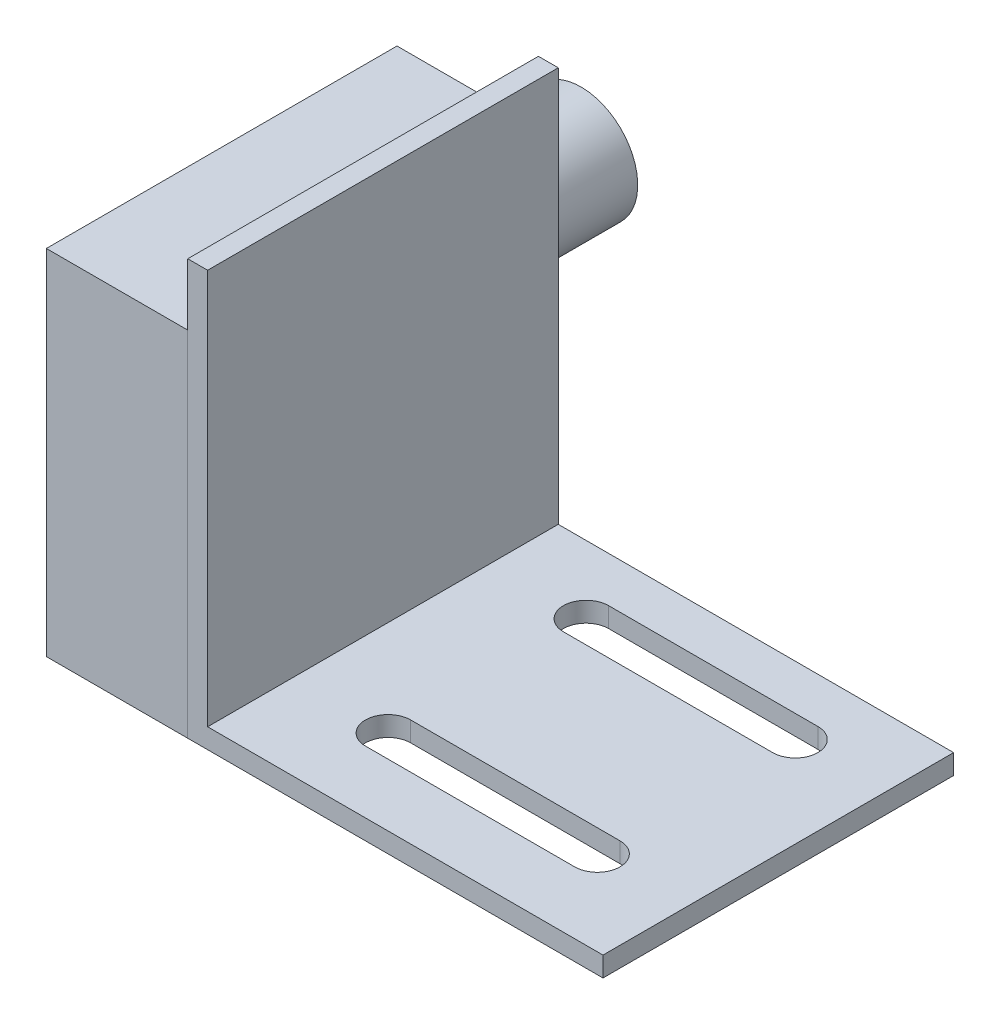
ISO-10303-21;
HEADER;
FILE_DESCRIPTION(('STEP AP214'),'2;1');
FILE_NAME('part.step','',(''),(''),'','','');
FILE_SCHEMA(('AUTOMOTIVE_DESIGN { 1 0 10303 214 1 1 1 1 }'));
ENDSEC;
DATA;
#1=APPLICATION_CONTEXT('core data for automotive mechanical design processes');
#2=APPLICATION_PROTOCOL_DEFINITION('international standard','automotive_design',2000,#1);
#3=PRODUCT_CONTEXT('',#1,'mechanical');
#4=PRODUCT('Part','Part','',(#3));
#5=PRODUCT_RELATED_PRODUCT_CATEGORY('part','',(#4));
#6=PRODUCT_DEFINITION_FORMATION('','',#4);
#7=PRODUCT_DEFINITION_CONTEXT('part definition',#1,'design');
#8=PRODUCT_DEFINITION('design','',#6,#7);
#9=PRODUCT_DEFINITION_SHAPE('','',#8);
#10=(LENGTH_UNIT() NAMED_UNIT(*) SI_UNIT(.MILLI.,.METRE.));
#11=(NAMED_UNIT(*) PLANE_ANGLE_UNIT() SI_UNIT($,.RADIAN.));
#12=(NAMED_UNIT(*) SI_UNIT($,.STERADIAN.) SOLID_ANGLE_UNIT());
#13=UNCERTAINTY_MEASURE_WITH_UNIT(LENGTH_MEASURE(1.E-05),#10,'distance_accuracy_value','');
#14=(GEOMETRIC_REPRESENTATION_CONTEXT(3) GLOBAL_UNCERTAINTY_ASSIGNED_CONTEXT((#13)) GLOBAL_UNIT_ASSIGNED_CONTEXT((#10,
#11,#12)) REPRESENTATION_CONTEXT('',''));
#15=CARTESIAN_POINT('',(0.,0.,0.));
#16=DIRECTION('',(0.,0.,1.));
#17=DIRECTION('',(1.,0.,0.));
#18=AXIS2_PLACEMENT_3D('',#15,#16,#17);
#19=CARTESIAN_POINT('',(-12.7,0.,15.748));
#20=DIRECTION('',(0.,0.,-1.));
#21=DIRECTION('',(-1.,0.,0.));
#22=AXIS2_PLACEMENT_3D('',#19,#20,#21);
#23=PLANE('',#22);
#24=DIRECTION('',(0.,1.,0.));
#25=VECTOR('',#24,1.);
#26=CARTESIAN_POINT('',(0.,0.,15.748));
#27=LINE('',#26,#25);
#28=CARTESIAN_POINT('',(0.,0.,15.748));
#29=VERTEX_POINT('',#28);
#30=CARTESIAN_POINT('',(0.,31.75,15.748));
#31=VERTEX_POINT('',#30);
#32=EDGE_CURVE('E110',#29,#31,#27,.T.);
#33=ORIENTED_EDGE('',*,*,#32,.T.);
#34=DIRECTION('',(1.,0.,0.));
#35=VECTOR('',#34,1.);
#36=CARTESIAN_POINT('',(-12.7,31.75,15.748));
#37=LINE('',#36,#35);
#38=CARTESIAN_POINT('',(-12.7,31.75,15.748));
#39=VERTEX_POINT('',#38);
#40=EDGE_CURVE('E47',#39,#31,#37,.T.);
#41=ORIENTED_EDGE('',*,*,#40,.F.);
#42=DIRECTION('',(0.,1.,0.));
#43=VECTOR('',#42,1.);
#44=CARTESIAN_POINT('',(-12.7,0.,15.748));
#45=LINE('',#44,#43);
#46=CARTESIAN_POINT('',(-12.7,0.,15.748));
#47=VERTEX_POINT('',#46);
#48=EDGE_CURVE('E97',#47,#39,#45,.T.);
#49=ORIENTED_EDGE('',*,*,#48,.F.);
#50=DIRECTION('',(1.,0.,0.));
#51=VECTOR('',#50,1.);
#52=CARTESIAN_POINT('',(-12.7,0.,15.748));
#53=LINE('',#52,#51);
#54=EDGE_CURVE('E106',#47,#29,#53,.T.);
#55=ORIENTED_EDGE('',*,*,#54,.T.);
#56=EDGE_LOOP('',(#33,#41,#49,#55));
#57=FACE_BOUND('',#56,.T.);
#58=ADVANCED_FACE('F44',(#57),#23,.F.);
#59=CARTESIAN_POINT('',(-12.7,31.75,15.748));
#60=DIRECTION('',(0.,-1.,0.));
#61=DIRECTION('',(0.,0.,-1.));
#62=AXIS2_PLACEMENT_3D('',#59,#60,#61);
#63=PLANE('',#62);
#64=DIRECTION('',(0.,0.,-1.));
#65=VECTOR('',#64,1.);
#66=CARTESIAN_POINT('',(0.,31.75,15.748));
#67=LINE('',#66,#65);
#68=CARTESIAN_POINT('',(0.,31.75,-15.748));
#69=VERTEX_POINT('',#68);
#70=EDGE_CURVE('E102',#31,#69,#67,.T.);
#71=ORIENTED_EDGE('',*,*,#70,.T.);
#72=DIRECTION('',(1.,0.,0.));
#73=VECTOR('',#72,1.);
#74=CARTESIAN_POINT('',(-12.7,31.75,-15.748));
#75=LINE('',#74,#73);
#76=CARTESIAN_POINT('',(-12.7,31.75,-15.748));
#77=VERTEX_POINT('',#76);
#78=EDGE_CURVE('E100',#77,#69,#75,.T.);
#79=ORIENTED_EDGE('',*,*,#78,.F.);
#80=DIRECTION('',(0.,0.,-1.));
#81=VECTOR('',#80,1.);
#82=CARTESIAN_POINT('',(-12.7,31.75,15.748));
#83=LINE('',#82,#81);
#84=EDGE_CURVE('E92',#39,#77,#83,.T.);
#85=ORIENTED_EDGE('',*,*,#84,.F.);
#86=ORIENTED_EDGE('',*,*,#40,.T.);
#87=EDGE_LOOP('',(#71,#79,#85,#86));
#88=FACE_BOUND('',#87,.T.);
#89=ADVANCED_FACE('F101',(#88),#63,.F.);
#90=CARTESIAN_POINT('',(-12.7,0.,-15.748));
#91=DIRECTION('',(0.,0.,1.));
#92=DIRECTION('',(1.,0.,0.));
#93=AXIS2_PLACEMENT_3D('',#90,#91,#92);
#94=PLANE('',#93);
#95=CARTESIAN_POINT('',(-6.32090999527844,21.59,-15.748));
#96=DIRECTION('',(0.,0.,-1.));
#97=DIRECTION('',(-1.,0.,0.));
#98=AXIS2_PLACEMENT_3D('',#95,#96,#97);
#99=CIRCLE('',#98,5.08);
#100=CARTESIAN_POINT('',(-11.4009099952784,21.59,-15.748));
#101=VERTEX_POINT('',#100);
#102=EDGE_CURVE('E12',#101,#101,#99,.T.);
#103=ORIENTED_EDGE('',*,*,#102,.F.);
#104=EDGE_LOOP('',(#103));
#105=FACE_BOUND('',#104,.T.);
#106=DIRECTION('',(0.,-1.,0.));
#107=VECTOR('',#106,1.);
#108=CARTESIAN_POINT('',(0.,0.,-15.748));
#109=LINE('',#108,#107);
#110=CARTESIAN_POINT('',(0.,0.,-15.748));
#111=VERTEX_POINT('',#110);
#112=EDGE_CURVE('E78',#69,#111,#109,.T.);
#113=ORIENTED_EDGE('',*,*,#112,.T.);
#114=DIRECTION('',(1.,0.,0.));
#115=VECTOR('',#114,1.);
#116=CARTESIAN_POINT('',(-12.7,0.,-15.748));
#117=LINE('',#116,#115);
#118=CARTESIAN_POINT('',(-12.7,0.,-15.748));
#119=VERTEX_POINT('',#118);
#120=EDGE_CURVE('E103',#119,#111,#117,.T.);
#121=ORIENTED_EDGE('',*,*,#120,.F.);
#122=DIRECTION('',(0.,-1.,0.));
#123=VECTOR('',#122,1.);
#124=CARTESIAN_POINT('',(-12.7,0.,-15.748));
#125=LINE('',#124,#123);
#126=EDGE_CURVE('E95',#77,#119,#125,.T.);
#127=ORIENTED_EDGE('',*,*,#126,.F.);
#128=ORIENTED_EDGE('',*,*,#78,.T.);
#129=EDGE_LOOP('',(#113,#121,#127,#128));
#130=FACE_BOUND('',#129,.T.);
#131=ADVANCED_FACE('F104',(#105,#130),#94,.F.);
#132=CARTESIAN_POINT('',(-12.7,0.,15.748));
#133=DIRECTION('',(0.,1.,0.));
#134=DIRECTION('',(0.,0.,1.));
#135=AXIS2_PLACEMENT_3D('',#132,#133,#134);
#136=PLANE('',#135);
#137=DIRECTION('',(0.,0.,1.));
#138=VECTOR('',#137,1.);
#139=CARTESIAN_POINT('',(0.,0.,15.748));
#140=LINE('',#139,#138);
#141=EDGE_CURVE('E84',#111,#29,#140,.T.);
#142=ORIENTED_EDGE('',*,*,#141,.T.);
#143=ORIENTED_EDGE('',*,*,#54,.F.);
#144=DIRECTION('',(0.,0.,1.));
#145=VECTOR('',#144,1.);
#146=CARTESIAN_POINT('',(-12.7,0.,15.748));
#147=LINE('',#146,#145);
#148=EDGE_CURVE('E61',#119,#47,#147,.T.);
#149=ORIENTED_EDGE('',*,*,#148,.F.);
#150=ORIENTED_EDGE('',*,*,#120,.T.);
#151=EDGE_LOOP('',(#142,#143,#149,#150));
#152=FACE_BOUND('',#151,.T.);
#153=ADVANCED_FACE('F118',(#152),#136,.F.);
#154=CARTESIAN_POINT('',(-12.7,0.,0.));
#155=DIRECTION('',(-1.,0.,0.));
#156=DIRECTION('',(0.,0.,1.));
#157=AXIS2_PLACEMENT_3D('',#154,#155,#156);
#158=PLANE('',#157);
#159=ORIENTED_EDGE('',*,*,#48,.T.);
#160=ORIENTED_EDGE('',*,*,#84,.T.);
#161=ORIENTED_EDGE('',*,*,#126,.T.);
#162=ORIENTED_EDGE('',*,*,#148,.T.);
#163=EDGE_LOOP('',(#159,#160,#161,#162));
#164=FACE_BOUND('',#163,.T.);
#165=ADVANCED_FACE('F93',(#164),#158,.T.);
#166=CARTESIAN_POINT('',(0.,0.,0.));
#167=DIRECTION('',(-1.,0.,0.));
#168=DIRECTION('',(0.,0.,1.));
#169=AXIS2_PLACEMENT_3D('',#166,#167,#168);
#170=PLANE('',#169);
#171=ORIENTED_EDGE('',*,*,#32,.F.);
#172=ORIENTED_EDGE('',*,*,#141,.F.);
#173=ORIENTED_EDGE('',*,*,#112,.F.);
#174=ORIENTED_EDGE('',*,*,#70,.F.);
#175=EDGE_LOOP('',(#171,#172,#173,#174));
#176=FACE_BOUND('',#175,.T.);
#177=ADVANCED_FACE('F121',(#176),#170,.F.);
#178=CARTESIAN_POINT('',(-6.32090999527844,21.59,-25.908));
#179=DIRECTION('',(0.,0.,1.));
#180=DIRECTION('',(1.,0.,0.));
#181=AXIS2_PLACEMENT_3D('',#178,#179,#180);
#182=CYLINDRICAL_SURFACE('',#181,5.08);
#183=CARTESIAN_POINT('',(-6.32090999527844,21.59,-25.908));
#184=DIRECTION('',(0.,0.,-1.));
#185=DIRECTION('',(-1.,0.,0.));
#186=AXIS2_PLACEMENT_3D('',#183,#184,#185);
#187=CIRCLE('',#186,5.08);
#188=CARTESIAN_POINT('',(-11.4009099952784,21.59,-25.908));
#189=VERTEX_POINT('',#188);
#190=EDGE_CURVE('E113',#189,#189,#187,.T.);
#191=ORIENTED_EDGE('',*,*,#190,.F.);
#192=EDGE_LOOP('',(#191));
#193=FACE_BOUND('',#192,.T.);
#194=ORIENTED_EDGE('',*,*,#102,.T.);
#195=EDGE_LOOP('',(#194));
#196=FACE_BOUND('',#195,.T.);
#197=ADVANCED_FACE('F129',(#193,#196),#182,.T.);
#198=CARTESIAN_POINT('',(-6.32090999527844,21.59,-25.908));
#199=DIRECTION('',(0.,0.,-1.));
#200=DIRECTION('',(-1.,0.,0.));
#201=AXIS2_PLACEMENT_3D('',#198,#199,#200);
#202=PLANE('',#201);
#203=ORIENTED_EDGE('',*,*,#190,.T.);
#204=EDGE_LOOP('',(#203));
#205=FACE_BOUND('',#204,.T.);
#206=ADVANCED_FACE('F127',(#205),#202,.T.);
#207=CLOSED_SHELL('',(#58,#89,#131,#153,#165,#177,#197,#206));
#208=MANIFOLD_SOLID_BREP('B2',#207);
#209=CARTESIAN_POINT('',(37.2983127050204,0.,15.748));
#210=DIRECTION('',(0.,1.,0.));
#211=DIRECTION('',(-1.,0.,0.));
#212=AXIS2_PLACEMENT_3D('',#209,#210,#211);
#213=PLANE('',#212);
#214=DIRECTION('',(1.,0.,0.));
#215=VECTOR('',#214,1.);
#216=CARTESIAN_POINT('',(29.1703127050204,0.,10.16));
#217=LINE('',#216,#215);
#218=CARTESIAN_POINT('',(10.3743127050204,0.,10.16));
#219=VERTEX_POINT('',#218);
#220=CARTESIAN_POINT('',(29.1703127050204,0.,10.16));
#221=VERTEX_POINT('',#220);
#222=EDGE_CURVE('E305',#219,#221,#217,.T.);
#223=ORIENTED_EDGE('',*,*,#222,.T.);
#224=CARTESIAN_POINT('',(29.1703127050204,0.,8.128));
#225=DIRECTION('',(0.,1.,0.));
#226=DIRECTION('',(0.,0.,1.));
#227=AXIS2_PLACEMENT_3D('',#224,#225,#226);
#228=CIRCLE('',#227,2.032);
#229=CARTESIAN_POINT('',(29.1703127050204,0.,6.096));
#230=VERTEX_POINT('',#229);
#231=EDGE_CURVE('E299',#221,#230,#228,.T.);
#232=ORIENTED_EDGE('',*,*,#231,.T.);
#233=DIRECTION('',(-1.,0.,0.));
#234=VECTOR('',#233,1.);
#235=CARTESIAN_POINT('',(29.1703127050204,0.,6.096));
#236=LINE('',#235,#234);
#237=CARTESIAN_POINT('',(10.3743127050204,0.,6.096));
#238=VERTEX_POINT('',#237);
#239=EDGE_CURVE('E308',#230,#238,#236,.T.);
#240=ORIENTED_EDGE('',*,*,#239,.T.);
#241=CARTESIAN_POINT('',(10.3743127050204,0.,8.128));
#242=DIRECTION('',(0.,1.,0.));
#243=DIRECTION('',(0.,0.,1.));
#244=AXIS2_PLACEMENT_3D('',#241,#242,#243);
#245=CIRCLE('',#244,2.032);
#246=EDGE_CURVE('E211',#238,#219,#245,.T.);
#247=ORIENTED_EDGE('',*,*,#246,.T.);
#248=EDGE_LOOP('',(#223,#232,#240,#247));
#249=FACE_BOUND('',#248,.T.);
#250=DIRECTION('',(1.,0.,0.));
#251=VECTOR('',#250,1.);
#252=CARTESIAN_POINT('',(29.1703127050204,0.,-7.62));
#253=LINE('',#252,#251);
#254=CARTESIAN_POINT('',(10.3743127050204,0.,-7.61999999999999));
#255=VERTEX_POINT('',#254);
#256=CARTESIAN_POINT('',(29.1703127050204,0.,-7.62));
#257=VERTEX_POINT('',#256);
#258=EDGE_CURVE('E343',#255,#257,#253,.T.);
#259=ORIENTED_EDGE('',*,*,#258,.T.);
#260=CARTESIAN_POINT('',(29.1703127050204,0.,-9.652));
#261=DIRECTION('',(0.,1.,0.));
#262=DIRECTION('',(0.,0.,1.));
#263=AXIS2_PLACEMENT_3D('',#260,#261,#262);
#264=CIRCLE('',#263,2.032);
#265=CARTESIAN_POINT('',(29.1703127050204,0.,-11.684));
#266=VERTEX_POINT('',#265);
#267=EDGE_CURVE('E333',#257,#266,#264,.T.);
#268=ORIENTED_EDGE('',*,*,#267,.T.);
#269=DIRECTION('',(-1.,0.,0.));
#270=VECTOR('',#269,1.);
#271=CARTESIAN_POINT('',(29.1703127050204,0.,-11.684));
#272=LINE('',#271,#270);
#273=CARTESIAN_POINT('',(10.3743127050204,0.,-11.684));
#274=VERTEX_POINT('',#273);
#275=EDGE_CURVE('E336',#266,#274,#272,.T.);
#276=ORIENTED_EDGE('',*,*,#275,.T.);
#277=CARTESIAN_POINT('',(10.3743127050204,0.,-9.652));
#278=DIRECTION('',(0.,1.,0.));
#279=DIRECTION('',(0.,0.,1.));
#280=AXIS2_PLACEMENT_3D('',#277,#278,#279);
#281=CIRCLE('',#280,2.032);
#282=EDGE_CURVE('E340',#274,#255,#281,.T.);
#283=ORIENTED_EDGE('',*,*,#282,.T.);
#284=EDGE_LOOP('',(#259,#268,#276,#283));
#285=FACE_BOUND('',#284,.T.);
#286=DIRECTION('',(1.,0.,0.));
#287=VECTOR('',#286,1.);
#288=CARTESIAN_POINT('',(37.2983127050204,0.,-15.748));
#289=LINE('',#288,#287);
#290=CARTESIAN_POINT('',(0.,0.,-15.748));
#291=VERTEX_POINT('',#290);
#292=CARTESIAN_POINT('',(37.2983127050204,0.,-15.748));
#293=VERTEX_POINT('',#292);
#294=EDGE_CURVE('E358',#291,#293,#289,.T.);
#295=ORIENTED_EDGE('',*,*,#294,.T.);
#296=DIRECTION('',(0.,0.,-1.));
#297=VECTOR('',#296,1.);
#298=CARTESIAN_POINT('',(37.2983127050204,0.,15.748));
#299=LINE('',#298,#297);
#300=CARTESIAN_POINT('',(37.2983127050204,0.,15.748));
#301=VERTEX_POINT('',#300);
#302=EDGE_CURVE('E42',#301,#293,#299,.T.);
#303=ORIENTED_EDGE('',*,*,#302,.F.);
#304=DIRECTION('',(1.,0.,0.));
#305=VECTOR('',#304,1.);
#306=CARTESIAN_POINT('',(37.2983127050204,0.,15.748));
#307=LINE('',#306,#305);
#308=CARTESIAN_POINT('',(0.,0.,15.748));
#309=VERTEX_POINT('',#308);
#310=EDGE_CURVE('E365',#309,#301,#307,.T.);
#311=ORIENTED_EDGE('',*,*,#310,.F.);
#312=DIRECTION('',(0.,0.,-1.));
#313=VECTOR('',#312,1.);
#314=CARTESIAN_POINT('',(0.,0.,15.748));
#315=LINE('',#314,#313);
#316=EDGE_CURVE('E379',#309,#291,#315,.T.);
#317=ORIENTED_EDGE('',*,*,#316,.T.);
#318=EDGE_LOOP('',(#295,#303,#311,#317));
#319=FACE_BOUND('',#318,.T.);
#320=ADVANCED_FACE('F197',(#249,#285,#319),#213,.F.);
#321=CARTESIAN_POINT('',(37.2983127050204,1.78490776787044,15.748));
#322=DIRECTION('',(-1.,0.,0.));
#323=DIRECTION('',(0.,0.,1.));
#324=AXIS2_PLACEMENT_3D('',#321,#322,#323);
#325=PLANE('',#324);
#326=DIRECTION('',(0.,1.,0.));
#327=VECTOR('',#326,1.);
#328=CARTESIAN_POINT('',(37.2983127050204,1.78490776787044,-15.748));
#329=LINE('',#328,#327);
#330=CARTESIAN_POINT('',(37.2983127050204,1.78490776787044,-15.748));
#331=VERTEX_POINT('',#330);
#332=EDGE_CURVE('E382',#293,#331,#329,.T.);
#333=ORIENTED_EDGE('',*,*,#332,.T.);
#334=DIRECTION('',(0.,0.,-1.));
#335=VECTOR('',#334,1.);
#336=CARTESIAN_POINT('',(37.2983127050204,1.78490776787044,15.748));
#337=LINE('',#336,#335);
#338=CARTESIAN_POINT('',(37.2983127050204,1.78490776787044,15.748));
#339=VERTEX_POINT('',#338);
#340=EDGE_CURVE('E204',#339,#331,#337,.T.);
#341=ORIENTED_EDGE('',*,*,#340,.F.);
#342=DIRECTION('',(0.,1.,0.));
#343=VECTOR('',#342,1.);
#344=CARTESIAN_POINT('',(37.2983127050204,1.78490776787044,15.748));
#345=LINE('',#344,#343);
#346=EDGE_CURVE('E368',#301,#339,#345,.T.);
#347=ORIENTED_EDGE('',*,*,#346,.F.);
#348=ORIENTED_EDGE('',*,*,#302,.T.);
#349=EDGE_LOOP('',(#333,#341,#347,#348));
#350=FACE_BOUND('',#349,.T.);
#351=ADVANCED_FACE('F429',(#350),#325,.F.);
#352=CARTESIAN_POINT('',(1.78490776787044,1.78490776787044,15.748));
#353=DIRECTION('',(0.,-1.,0.));
#354=DIRECTION('',(0.,0.,-1.));
#355=AXIS2_PLACEMENT_3D('',#352,#353,#354);
#356=PLANE('',#355);
#357=DIRECTION('',(-1.,0.,0.));
#358=VECTOR('',#357,1.);
#359=CARTESIAN_POINT('',(29.1703127050204,1.78490776787044,6.096));
#360=LINE('',#359,#358);
#361=CARTESIAN_POINT('',(29.1703127050204,1.78490776787044,6.096));
#362=VERTEX_POINT('',#361);
#363=CARTESIAN_POINT('',(10.3743127050204,1.78490776787044,6.096));
#364=VERTEX_POINT('',#363);
#365=EDGE_CURVE('E323',#362,#364,#360,.T.);
#366=ORIENTED_EDGE('',*,*,#365,.F.);
#367=CARTESIAN_POINT('',(29.1703127050204,1.78490776787044,8.128));
#368=DIRECTION('',(0.,1.,0.));
#369=DIRECTION('',(0.,0.,1.));
#370=AXIS2_PLACEMENT_3D('',#367,#368,#369);
#371=CIRCLE('',#370,2.032);
#372=CARTESIAN_POINT('',(29.1703127050204,1.78490776787044,10.16));
#373=VERTEX_POINT('',#372);
#374=EDGE_CURVE('E219',#373,#362,#371,.T.);
#375=ORIENTED_EDGE('',*,*,#374,.F.);
#376=DIRECTION('',(1.,0.,0.));
#377=VECTOR('',#376,1.);
#378=CARTESIAN_POINT('',(29.1703127050204,1.78490776787044,10.16));
#379=LINE('',#378,#377);
#380=CARTESIAN_POINT('',(10.3743127050204,1.78490776787044,10.16));
#381=VERTEX_POINT('',#380);
#382=EDGE_CURVE('E314',#381,#373,#379,.T.);
#383=ORIENTED_EDGE('',*,*,#382,.F.);
#384=CARTESIAN_POINT('',(10.3743127050204,1.78490776787044,8.128));
#385=DIRECTION('',(0.,1.,0.));
#386=DIRECTION('',(0.,0.,1.));
#387=AXIS2_PLACEMENT_3D('',#384,#385,#386);
#388=CIRCLE('',#387,2.032);
#389=EDGE_CURVE('E317',#364,#381,#388,.T.);
#390=ORIENTED_EDGE('',*,*,#389,.F.);
#391=EDGE_LOOP('',(#366,#375,#383,#390));
#392=FACE_BOUND('',#391,.T.);
#393=DIRECTION('',(-1.,0.,0.));
#394=VECTOR('',#393,1.);
#395=CARTESIAN_POINT('',(29.1703127050204,1.78490776787044,-11.684));
#396=LINE('',#395,#394);
#397=CARTESIAN_POINT('',(29.1703127050204,1.78490776787044,-11.684));
#398=VERTEX_POINT('',#397);
#399=CARTESIAN_POINT('',(10.3743127050204,1.78490776787044,-11.684));
#400=VERTEX_POINT('',#399);
#401=EDGE_CURVE('E348',#398,#400,#396,.T.);
#402=ORIENTED_EDGE('',*,*,#401,.F.);
#403=CARTESIAN_POINT('',(29.1703127050204,1.78490776787044,-9.652));
#404=DIRECTION('',(0.,1.,0.));
#405=DIRECTION('',(0.,0.,1.));
#406=AXIS2_PLACEMENT_3D('',#403,#404,#405);
#407=CIRCLE('',#406,2.032);
#408=CARTESIAN_POINT('',(29.1703127050204,1.78490776787044,-7.62));
#409=VERTEX_POINT('',#408);
#410=EDGE_CURVE('E329',#409,#398,#407,.T.);
#411=ORIENTED_EDGE('',*,*,#410,.F.);
#412=DIRECTION('',(1.,0.,0.));
#413=VECTOR('',#412,1.);
#414=CARTESIAN_POINT('',(29.1703127050204,1.78490776787044,-7.62));
#415=LINE('',#414,#413);
#416=CARTESIAN_POINT('',(10.3743127050204,1.78490776787044,-7.61999999999999));
#417=VERTEX_POINT('',#416);
#418=EDGE_CURVE('E337',#417,#409,#415,.T.);
#419=ORIENTED_EDGE('',*,*,#418,.F.);
#420=CARTESIAN_POINT('',(10.3743127050204,1.78490776787044,-9.652));
#421=DIRECTION('',(0.,1.,0.));
#422=DIRECTION('',(0.,0.,1.));
#423=AXIS2_PLACEMENT_3D('',#420,#421,#422);
#424=CIRCLE('',#423,2.032);
#425=EDGE_CURVE('E351',#400,#417,#424,.T.);
#426=ORIENTED_EDGE('',*,*,#425,.F.);
#427=EDGE_LOOP('',(#402,#411,#419,#426));
#428=FACE_BOUND('',#427,.T.);
#429=DIRECTION('',(-1.,0.,0.));
#430=VECTOR('',#429,1.);
#431=CARTESIAN_POINT('',(1.78490776787044,1.78490776787044,-15.748));
#432=LINE('',#431,#430);
#433=CARTESIAN_POINT('',(1.78490776787044,1.78490776787044,-15.748));
#434=VERTEX_POINT('',#433);
#435=EDGE_CURVE('E384',#331,#434,#432,.T.);
#436=ORIENTED_EDGE('',*,*,#435,.T.);
#437=DIRECTION('',(0.,0.,-1.));
#438=VECTOR('',#437,1.);
#439=CARTESIAN_POINT('',(1.78490776787044,1.78490776787044,15.748));
#440=LINE('',#439,#438);
#441=CARTESIAN_POINT('',(1.78490776787044,1.78490776787044,15.748));
#442=VERTEX_POINT('',#441);
#443=EDGE_CURVE('E399',#442,#434,#440,.T.);
#444=ORIENTED_EDGE('',*,*,#443,.F.);
#445=DIRECTION('',(-1.,0.,0.));
#446=VECTOR('',#445,1.);
#447=CARTESIAN_POINT('',(1.78490776787044,1.78490776787044,15.748));
#448=LINE('',#447,#446);
#449=EDGE_CURVE('E371',#339,#442,#448,.T.);
#450=ORIENTED_EDGE('',*,*,#449,.F.);
#451=ORIENTED_EDGE('',*,*,#340,.T.);
#452=EDGE_LOOP('',(#436,#444,#450,#451));
#453=FACE_BOUND('',#452,.T.);
#454=ADVANCED_FACE('F406',(#392,#428,#453),#356,.F.);
#455=CARTESIAN_POINT('',(1.78490776787044,37.2983127050204,15.748));
#456=DIRECTION('',(-1.,0.,0.));
#457=DIRECTION('',(0.,-1.,0.));
#458=AXIS2_PLACEMENT_3D('',#455,#456,#457);
#459=PLANE('',#458);
#460=DIRECTION('',(0.,1.,0.));
#461=VECTOR('',#460,1.);
#462=CARTESIAN_POINT('',(1.78490776787044,37.2983127050204,-15.748));
#463=LINE('',#462,#461);
#464=CARTESIAN_POINT('',(1.78490776787044,37.2983127050204,-15.748));
#465=VERTEX_POINT('',#464);
#466=EDGE_CURVE('E386',#434,#465,#463,.T.);
#467=ORIENTED_EDGE('',*,*,#466,.T.);
#468=DIRECTION('',(0.,0.,-1.));
#469=VECTOR('',#468,1.);
#470=CARTESIAN_POINT('',(1.78490776787044,37.2983127050204,15.748));
#471=LINE('',#470,#469);
#472=CARTESIAN_POINT('',(1.78490776787044,37.2983127050204,15.748));
#473=VERTEX_POINT('',#472);
#474=EDGE_CURVE('E396',#473,#465,#471,.T.);
#475=ORIENTED_EDGE('',*,*,#474,.F.);
#476=DIRECTION('',(0.,1.,0.));
#477=VECTOR('',#476,1.);
#478=CARTESIAN_POINT('',(1.78490776787044,37.2983127050204,15.748));
#479=LINE('',#478,#477);
#480=EDGE_CURVE('E373',#442,#473,#479,.T.);
#481=ORIENTED_EDGE('',*,*,#480,.F.);
#482=ORIENTED_EDGE('',*,*,#443,.T.);
#483=EDGE_LOOP('',(#467,#475,#481,#482));
#484=FACE_BOUND('',#483,.T.);
#485=ADVANCED_FACE('F417',(#484),#459,.F.);
#486=CARTESIAN_POINT('',(0.,37.2983127050204,15.748));
#487=DIRECTION('',(0.,-1.,0.));
#488=DIRECTION('',(0.,0.,-1.));
#489=AXIS2_PLACEMENT_3D('',#486,#487,#488);
#490=PLANE('',#489);
#491=DIRECTION('',(-1.,0.,0.));
#492=VECTOR('',#491,1.);
#493=CARTESIAN_POINT('',(0.,37.2983127050204,-15.748));
#494=LINE('',#493,#492);
#495=CARTESIAN_POINT('',(0.,37.2983127050204,-15.748));
#496=VERTEX_POINT('',#495);
#497=EDGE_CURVE('E388',#465,#496,#494,.T.);
#498=ORIENTED_EDGE('',*,*,#497,.T.);
#499=DIRECTION('',(0.,0.,-1.));
#500=VECTOR('',#499,1.);
#501=CARTESIAN_POINT('',(0.,37.2983127050204,15.748));
#502=LINE('',#501,#500);
#503=CARTESIAN_POINT('',(0.,37.2983127050204,15.748));
#504=VERTEX_POINT('',#503);
#505=EDGE_CURVE('E393',#504,#496,#502,.T.);
#506=ORIENTED_EDGE('',*,*,#505,.F.);
#507=DIRECTION('',(-1.,0.,0.));
#508=VECTOR('',#507,1.);
#509=CARTESIAN_POINT('',(0.,37.2983127050204,15.748));
#510=LINE('',#509,#508);
#511=EDGE_CURVE('E375',#473,#504,#510,.T.);
#512=ORIENTED_EDGE('',*,*,#511,.F.);
#513=ORIENTED_EDGE('',*,*,#474,.T.);
#514=EDGE_LOOP('',(#498,#506,#512,#513));
#515=FACE_BOUND('',#514,.T.);
#516=ADVANCED_FACE('F421',(#515),#490,.F.);
#517=CARTESIAN_POINT('',(0.,0.,15.748));
#518=DIRECTION('',(1.,0.,0.));
#519=DIRECTION('',(0.,0.,-1.));
#520=AXIS2_PLACEMENT_3D('',#517,#518,#519);
#521=PLANE('',#520);
#522=DIRECTION('',(0.,-1.,0.));
#523=VECTOR('',#522,1.);
#524=CARTESIAN_POINT('',(0.,0.,-15.748));
#525=LINE('',#524,#523);
#526=EDGE_CURVE('E369',#496,#291,#525,.T.);
#527=ORIENTED_EDGE('',*,*,#526,.T.);
#528=ORIENTED_EDGE('',*,*,#316,.F.);
#529=DIRECTION('',(0.,-1.,0.));
#530=VECTOR('',#529,1.);
#531=CARTESIAN_POINT('',(0.,0.,15.748));
#532=LINE('',#531,#530);
#533=EDGE_CURVE('E377',#504,#309,#532,.T.);
#534=ORIENTED_EDGE('',*,*,#533,.F.);
#535=ORIENTED_EDGE('',*,*,#505,.T.);
#536=EDGE_LOOP('',(#527,#528,#534,#535));
#537=FACE_BOUND('',#536,.T.);
#538=ADVANCED_FACE('F432',(#537),#521,.F.);
#539=CARTESIAN_POINT('',(0.,0.,15.748));
#540=DIRECTION('',(0.,0.,-1.));
#541=DIRECTION('',(-1.,0.,0.));
#542=AXIS2_PLACEMENT_3D('',#539,#540,#541);
#543=PLANE('',#542);
#544=ORIENTED_EDGE('',*,*,#310,.T.);
#545=ORIENTED_EDGE('',*,*,#346,.T.);
#546=ORIENTED_EDGE('',*,*,#449,.T.);
#547=ORIENTED_EDGE('',*,*,#480,.T.);
#548=ORIENTED_EDGE('',*,*,#511,.T.);
#549=ORIENTED_EDGE('',*,*,#533,.T.);
#550=EDGE_LOOP('',(#544,#545,#546,#547,#548,#549));
#551=FACE_BOUND('',#550,.T.);
#552=ADVANCED_FACE('F425',(#551),#543,.F.);
#553=CARTESIAN_POINT('',(0.,0.,-15.748));
#554=DIRECTION('',(0.,0.,-1.));
#555=DIRECTION('',(-1.,0.,0.));
#556=AXIS2_PLACEMENT_3D('',#553,#554,#555);
#557=PLANE('',#556);
#558=ORIENTED_EDGE('',*,*,#294,.F.);
#559=ORIENTED_EDGE('',*,*,#526,.F.);
#560=ORIENTED_EDGE('',*,*,#497,.F.);
#561=ORIENTED_EDGE('',*,*,#466,.F.);
#562=ORIENTED_EDGE('',*,*,#435,.F.);
#563=ORIENTED_EDGE('',*,*,#332,.F.);
#564=EDGE_LOOP('',(#558,#559,#560,#561,#562,#563));
#565=FACE_BOUND('',#564,.T.);
#566=ADVANCED_FACE('F412',(#565),#557,.T.);
#567=CARTESIAN_POINT('',(29.1703127050204,0.,-9.652));
#568=DIRECTION('',(0.,1.,0.));
#569=DIRECTION('',(0.,0.,1.));
#570=AXIS2_PLACEMENT_3D('',#567,#568,#569);
#571=CYLINDRICAL_SURFACE('',#570,2.032);
#572=ORIENTED_EDGE('',*,*,#410,.T.);
#573=DIRECTION('',(0.,1.,0.));
#574=VECTOR('',#573,1.);
#575=CARTESIAN_POINT('',(29.1703127050204,0.,-11.684));
#576=LINE('',#575,#574);
#577=EDGE_CURVE('E346',#266,#398,#576,.T.);
#578=ORIENTED_EDGE('',*,*,#577,.F.);
#579=ORIENTED_EDGE('',*,*,#267,.F.);
#580=DIRECTION('',(0.,1.,0.));
#581=VECTOR('',#580,1.);
#582=CARTESIAN_POINT('',(29.1703127050204,0.,-7.62));
#583=LINE('',#582,#581);
#584=EDGE_CURVE('E356',#257,#409,#583,.T.);
#585=ORIENTED_EDGE('',*,*,#584,.T.);
#586=EDGE_LOOP('',(#572,#578,#579,#585));
#587=FACE_BOUND('',#586,.T.);
#588=ADVANCED_FACE('F480',(#587),#571,.F.);
#589=CARTESIAN_POINT('',(29.1703127050204,0.,-7.62));
#590=DIRECTION('',(0.,0.,1.));
#591=DIRECTION('',(1.,0.,0.));
#592=AXIS2_PLACEMENT_3D('',#589,#590,#591);
#593=PLANE('',#592);
#594=ORIENTED_EDGE('',*,*,#418,.T.);
#595=ORIENTED_EDGE('',*,*,#584,.F.);
#596=ORIENTED_EDGE('',*,*,#258,.F.);
#597=DIRECTION('',(0.,1.,0.));
#598=VECTOR('',#597,1.);
#599=CARTESIAN_POINT('',(10.3743127050204,0.,-7.61999999999999));
#600=LINE('',#599,#598);
#601=EDGE_CURVE('E359',#255,#417,#600,.T.);
#602=ORIENTED_EDGE('',*,*,#601,.T.);
#603=EDGE_LOOP('',(#594,#595,#596,#602));
#604=FACE_BOUND('',#603,.T.);
#605=ADVANCED_FACE('F488',(#604),#593,.F.);
#606=CARTESIAN_POINT('',(10.3743127050204,0.,-9.652));
#607=DIRECTION('',(0.,1.,0.));
#608=DIRECTION('',(0.,0.,1.));
#609=AXIS2_PLACEMENT_3D('',#606,#607,#608);
#610=CYLINDRICAL_SURFACE('',#609,2.032);
#611=ORIENTED_EDGE('',*,*,#425,.T.);
#612=ORIENTED_EDGE('',*,*,#601,.F.);
#613=ORIENTED_EDGE('',*,*,#282,.F.);
#614=DIRECTION('',(0.,1.,0.));
#615=VECTOR('',#614,1.);
#616=CARTESIAN_POINT('',(10.3743127050204,0.,-11.684));
#617=LINE('',#616,#615);
#618=EDGE_CURVE('E361',#274,#400,#617,.T.);
#619=ORIENTED_EDGE('',*,*,#618,.T.);
#620=EDGE_LOOP('',(#611,#612,#613,#619));
#621=FACE_BOUND('',#620,.T.);
#622=ADVANCED_FACE('F498',(#621),#610,.F.);
#623=CARTESIAN_POINT('',(29.1703127050204,0.,-11.684));
#624=DIRECTION('',(0.,0.,-1.));
#625=DIRECTION('',(-1.,0.,0.));
#626=AXIS2_PLACEMENT_3D('',#623,#624,#625);
#627=PLANE('',#626);
#628=ORIENTED_EDGE('',*,*,#401,.T.);
#629=ORIENTED_EDGE('',*,*,#618,.F.);
#630=ORIENTED_EDGE('',*,*,#275,.F.);
#631=ORIENTED_EDGE('',*,*,#577,.T.);
#632=EDGE_LOOP('',(#628,#629,#630,#631));
#633=FACE_BOUND('',#632,.T.);
#634=ADVANCED_FACE('F508',(#633),#627,.F.);
#635=CARTESIAN_POINT('',(29.1703127050204,0.,8.128));
#636=DIRECTION('',(0.,1.,0.));
#637=DIRECTION('',(0.,0.,1.));
#638=AXIS2_PLACEMENT_3D('',#635,#636,#637);
#639=CYLINDRICAL_SURFACE('',#638,2.032);
#640=ORIENTED_EDGE('',*,*,#374,.T.);
#641=DIRECTION('',(0.,1.,0.));
#642=VECTOR('',#641,1.);
#643=CARTESIAN_POINT('',(29.1703127050204,0.,6.096));
#644=LINE('',#643,#642);
#645=EDGE_CURVE('E295',#230,#362,#644,.T.);
#646=ORIENTED_EDGE('',*,*,#645,.F.);
#647=ORIENTED_EDGE('',*,*,#231,.F.);
#648=DIRECTION('',(0.,1.,0.));
#649=VECTOR('',#648,1.);
#650=CARTESIAN_POINT('',(29.1703127050204,0.,10.16));
#651=LINE('',#650,#649);
#652=EDGE_CURVE('E327',#221,#373,#651,.T.);
#653=ORIENTED_EDGE('',*,*,#652,.T.);
#654=EDGE_LOOP('',(#640,#646,#647,#653));
#655=FACE_BOUND('',#654,.T.);
#656=ADVANCED_FACE('F297',(#655),#639,.F.);
#657=CARTESIAN_POINT('',(29.1703127050204,0.,10.16));
#658=DIRECTION('',(0.,0.,1.));
#659=DIRECTION('',(1.,0.,0.));
#660=AXIS2_PLACEMENT_3D('',#657,#658,#659);
#661=PLANE('',#660);
#662=ORIENTED_EDGE('',*,*,#382,.T.);
#663=ORIENTED_EDGE('',*,*,#652,.F.);
#664=ORIENTED_EDGE('',*,*,#222,.F.);
#665=DIRECTION('',(0.,1.,0.));
#666=VECTOR('',#665,1.);
#667=CARTESIAN_POINT('',(10.3743127050204,0.,10.16));
#668=LINE('',#667,#666);
#669=EDGE_CURVE('E330',#219,#381,#668,.T.);
#670=ORIENTED_EDGE('',*,*,#669,.T.);
#671=EDGE_LOOP('',(#662,#663,#664,#670));
#672=FACE_BOUND('',#671,.T.);
#673=ADVANCED_FACE('F536',(#672),#661,.F.);
#674=CARTESIAN_POINT('',(10.3743127050204,0.,8.128));
#675=DIRECTION('',(0.,1.,0.));
#676=DIRECTION('',(0.,0.,1.));
#677=AXIS2_PLACEMENT_3D('',#674,#675,#676);
#678=CYLINDRICAL_SURFACE('',#677,2.032);
#679=ORIENTED_EDGE('',*,*,#389,.T.);
#680=ORIENTED_EDGE('',*,*,#669,.F.);
#681=ORIENTED_EDGE('',*,*,#246,.F.);
#682=DIRECTION('',(0.,1.,0.));
#683=VECTOR('',#682,1.);
#684=CARTESIAN_POINT('',(10.3743127050204,0.,6.096));
#685=LINE('',#684,#683);
#686=EDGE_CURVE('E304',#238,#364,#685,.T.);
#687=ORIENTED_EDGE('',*,*,#686,.T.);
#688=EDGE_LOOP('',(#679,#680,#681,#687));
#689=FACE_BOUND('',#688,.T.);
#690=ADVANCED_FACE('F545',(#689),#678,.F.);
#691=CARTESIAN_POINT('',(29.1703127050204,0.,6.096));
#692=DIRECTION('',(0.,0.,-1.));
#693=DIRECTION('',(-1.,0.,0.));
#694=AXIS2_PLACEMENT_3D('',#691,#692,#693);
#695=PLANE('',#694);
#696=ORIENTED_EDGE('',*,*,#365,.T.);
#697=ORIENTED_EDGE('',*,*,#686,.F.);
#698=ORIENTED_EDGE('',*,*,#239,.F.);
#699=ORIENTED_EDGE('',*,*,#645,.T.);
#700=EDGE_LOOP('',(#696,#697,#698,#699));
#701=FACE_BOUND('',#700,.T.);
#702=ADVANCED_FACE('F309',(#701),#695,.F.);
#703=CLOSED_SHELL('',(#320,#351,#454,#485,#516,#538,#552,#566,#588,#605,#622,#634,#656,#673,
#690,#702));
#704=MANIFOLD_SOLID_BREP('B6',#703);
#705=ADVANCED_BREP_SHAPE_REPRESENTATION('',(#18,#208,#704),#14);
#706=SHAPE_DEFINITION_REPRESENTATION(#9,#705);
ENDSEC;
END-ISO-10303-21;
